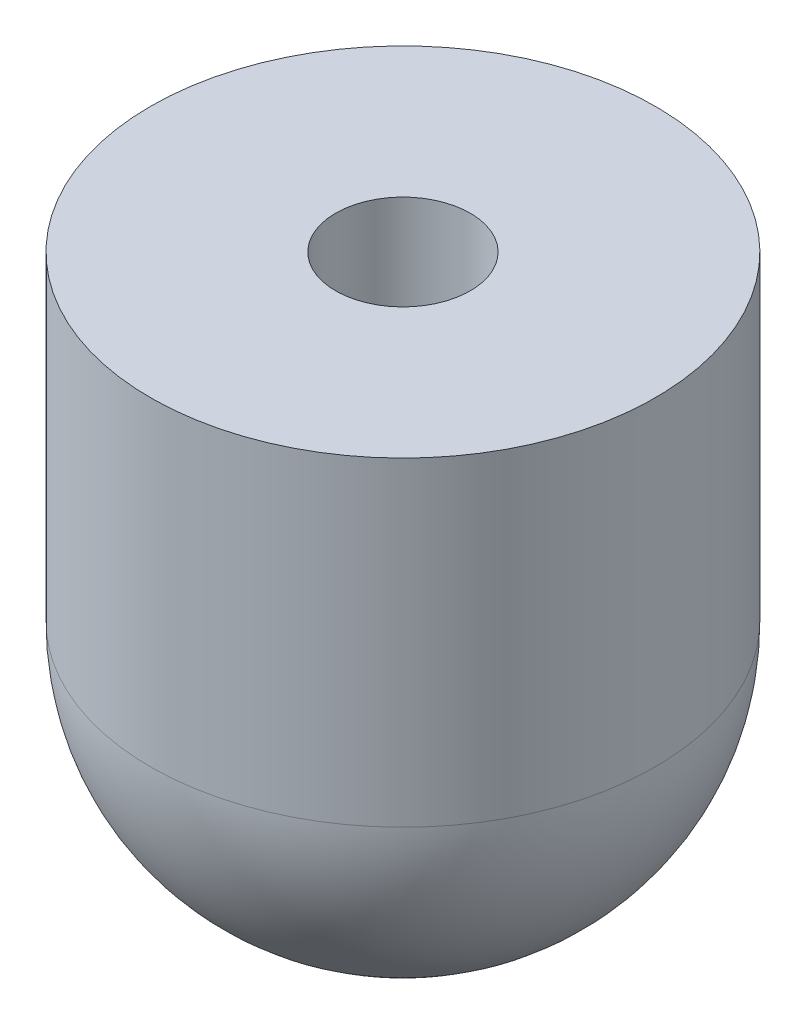
ISO-10303-21;
HEADER;
FILE_DESCRIPTION(('STEP AP214'),'2;1');
FILE_NAME('part.step','',(''),(''),'','','');
FILE_SCHEMA(('AUTOMOTIVE_DESIGN { 1 0 10303 214 1 1 1 1 }'));
ENDSEC;
DATA;
#1=APPLICATION_CONTEXT('core data for automotive mechanical design processes');
#2=APPLICATION_PROTOCOL_DEFINITION('international standard','automotive_design',2000,#1);
#3=PRODUCT_CONTEXT('',#1,'mechanical');
#4=PRODUCT('Part','Part','',(#3));
#5=PRODUCT_RELATED_PRODUCT_CATEGORY('part','',(#4));
#6=PRODUCT_DEFINITION_FORMATION('','',#4);
#7=PRODUCT_DEFINITION_CONTEXT('part definition',#1,'design');
#8=PRODUCT_DEFINITION('design','',#6,#7);
#9=PRODUCT_DEFINITION_SHAPE('','',#8);
#10=(LENGTH_UNIT() NAMED_UNIT(*) SI_UNIT(.MILLI.,.METRE.));
#11=(NAMED_UNIT(*) PLANE_ANGLE_UNIT() SI_UNIT($,.RADIAN.));
#12=(NAMED_UNIT(*) SI_UNIT($,.STERADIAN.) SOLID_ANGLE_UNIT());
#13=UNCERTAINTY_MEASURE_WITH_UNIT(LENGTH_MEASURE(1.E-05),#10,'distance_accuracy_value','');
#14=(GEOMETRIC_REPRESENTATION_CONTEXT(3) GLOBAL_UNCERTAINTY_ASSIGNED_CONTEXT((#13)) GLOBAL_UNIT_ASSIGNED_CONTEXT((#10,
#11,#12)) REPRESENTATION_CONTEXT('',''));
#15=CARTESIAN_POINT('',(0.,0.,0.));
#16=DIRECTION('',(0.,0.,1.));
#17=DIRECTION('',(1.,0.,0.));
#18=AXIS2_PLACEMENT_3D('',#15,#16,#17);
#19=CARTESIAN_POINT('',(0.,0.,0.));
#20=DIRECTION('',(0.,1.,0.));
#21=DIRECTION('',(-1.,0.,0.));
#22=AXIS2_PLACEMENT_3D('',#19,#20,#21);
#23=PLANE('',#22);
#24=CARTESIAN_POINT('',(0.,0.,0.));
#25=DIRECTION('',(0.,1.,0.));
#26=DIRECTION('',(-1.,0.,0.));
#27=AXIS2_PLACEMENT_3D('',#24,#25,#26);
#28=CIRCLE('',#27,2.);
#29=CARTESIAN_POINT('',(-2.,0.,0.));
#30=VERTEX_POINT('',#29);
#31=EDGE_CURVE('E196',#30,#30,#28,.T.);
#32=ORIENTED_EDGE('',*,*,#31,.F.);
#33=EDGE_LOOP('',(#32));
#34=FACE_BOUND('',#33,.T.);
#35=CARTESIAN_POINT('',(0.,0.,0.));
#36=DIRECTION('',(0.,1.,0.));
#37=DIRECTION('',(-1.,0.,0.));
#38=AXIS2_PLACEMENT_3D('',#35,#36,#37);
#39=CIRCLE('',#38,7.5);
#40=CARTESIAN_POINT('',(-7.5,0.,0.));
#41=VERTEX_POINT('',#40);
#42=EDGE_CURVE('E11',#41,#41,#39,.T.);
#43=ORIENTED_EDGE('',*,*,#42,.T.);
#44=EDGE_LOOP('',(#43));
#45=FACE_BOUND('',#44,.T.);
#46=ADVANCED_FACE('F45',(#34,#45),#23,.T.);
#47=CARTESIAN_POINT('',(0.,0.,0.));
#48=DIRECTION('',(0.,1.,0.));
#49=DIRECTION('',(-1.,0.,0.));
#50=AXIS2_PLACEMENT_3D('',#47,#48,#49);
#51=CYLINDRICAL_SURFACE('',#50,7.5);
#52=CARTESIAN_POINT('',(0.,-9.5,0.));
#53=DIRECTION('',(0.,1.,0.));
#54=DIRECTION('',(-1.,0.,0.));
#55=AXIS2_PLACEMENT_3D('',#52,#53,#54);
#56=CIRCLE('',#55,7.5);
#57=CARTESIAN_POINT('',(-7.5,-9.5,0.));
#58=VERTEX_POINT('',#57);
#59=EDGE_CURVE('E54',#58,#58,#56,.T.);
#60=ORIENTED_EDGE('',*,*,#59,.T.);
#61=EDGE_LOOP('',(#60));
#62=FACE_BOUND('',#61,.T.);
#63=ORIENTED_EDGE('',*,*,#42,.F.);
#64=EDGE_LOOP('',(#63));
#65=FACE_BOUND('',#64,.T.);
#66=ADVANCED_FACE('F172',(#62,#65),#51,.T.);
#67=CARTESIAN_POINT('',(0.,-9.5,0.));
#68=DIRECTION('',(0.,1.,0.));
#69=DIRECTION('',(-1.,0.,0.));
#70=AXIS2_PLACEMENT_3D('',#67,#68,#69);
#71=SPHERICAL_SURFACE('',#70,7.5);
#72=ORIENTED_EDGE('',*,*,#59,.F.);
#73=EDGE_LOOP('',(#72));
#74=FACE_BOUND('',#73,.T.);
#75=ADVANCED_FACE('F175',(#74),#71,.T.);
#76=CARTESIAN_POINT('',(0.,-17.001,0.));
#77=DIRECTION('',(0.,1.,0.));
#78=DIRECTION('',(-1.,0.,0.));
#79=AXIS2_PLACEMENT_3D('',#76,#77,#78);
#80=CYLINDRICAL_SURFACE('',#79,2.);
#81=ORIENTED_EDGE('',*,*,#31,.T.);
#82=EDGE_LOOP('',(#81));
#83=FACE_BOUND('',#82,.T.);
#84=CARTESIAN_POINT('',(0.,-3.,0.));
#85=DIRECTION('',(0.,1.,0.));
#86=DIRECTION('',(-1.,0.,0.));
#87=AXIS2_PLACEMENT_3D('',#84,#85,#86);
#88=CIRCLE('',#87,2.);
#89=CARTESIAN_POINT('',(-2.,-3.,0.));
#90=VERTEX_POINT('',#89);
#91=EDGE_CURVE('E141',#90,#90,#88,.F.);
#92=ORIENTED_EDGE('',*,*,#91,.T.);
#93=EDGE_LOOP('',(#92));
#94=FACE_BOUND('',#93,.T.);
#95=ADVANCED_FACE('F177',(#83,#94),#80,.F.);
#96=CARTESIAN_POINT('',(0.,-6.5,4.15692193816531));
#97=DIRECTION('',(0.5,0.,0.866025403784439));
#98=DIRECTION('',(0.866025403784439,0.,-0.5));
#99=AXIS2_PLACEMENT_3D('',#96,#97,#98);
#100=PLANE('',#99);
#101=DIRECTION('',(0.866025403784439,0.,-0.5));
#102=VECTOR('',#101,1.);
#103=CARTESIAN_POINT('',(0.,-3.,4.15692193816531));
#104=LINE('',#103,#102);
#105=CARTESIAN_POINT('',(0.,-3.,4.15692193816531));
#106=VERTEX_POINT('',#105);
#107=CARTESIAN_POINT('',(3.6,-3.,2.07846096908265));
#108=VERTEX_POINT('',#107);
#109=EDGE_CURVE('E137',#106,#108,#104,.T.);
#110=ORIENTED_EDGE('',*,*,#109,.T.);
#111=DIRECTION('',(0.,1.,0.));
#112=VECTOR('',#111,1.);
#113=CARTESIAN_POINT('',(3.6,-6.5,2.07846096908265));
#114=LINE('',#113,#112);
#115=CARTESIAN_POINT('',(3.6,-6.5,2.07846096908265));
#116=VERTEX_POINT('',#115);
#117=EDGE_CURVE('E91',#116,#108,#114,.T.);
#118=ORIENTED_EDGE('',*,*,#117,.F.);
#119=DIRECTION('',(0.866025403784439,0.,-0.5));
#120=VECTOR('',#119,1.);
#121=CARTESIAN_POINT('',(0.,-6.5,4.15692193816531));
#122=LINE('',#121,#120);
#123=CARTESIAN_POINT('',(0.,-6.5,4.15692193816531));
#124=VERTEX_POINT('',#123);
#125=EDGE_CURVE('E157',#124,#116,#122,.T.);
#126=ORIENTED_EDGE('',*,*,#125,.F.);
#127=DIRECTION('',(0.,1.,0.));
#128=VECTOR('',#127,1.);
#129=CARTESIAN_POINT('',(0.,-6.5,4.15692193816531));
#130=LINE('',#129,#128);
#131=EDGE_CURVE('E62',#124,#106,#130,.T.);
#132=ORIENTED_EDGE('',*,*,#131,.T.);
#133=EDGE_LOOP('',(#110,#118,#126,#132));
#134=FACE_BOUND('',#133,.T.);
#135=ADVANCED_FACE('F184',(#134),#100,.F.);
#136=CARTESIAN_POINT('',(-3.6,-6.5,2.07846096908265));
#137=DIRECTION('',(-0.5,0.,0.866025403784438));
#138=DIRECTION('',(0.866025403784439,0.,0.5));
#139=AXIS2_PLACEMENT_3D('',#136,#137,#138);
#140=PLANE('',#139);
#141=DIRECTION('',(0.866025403784438,0.,0.5));
#142=VECTOR('',#141,1.);
#143=CARTESIAN_POINT('',(-3.6,-3.,2.07846096908265));
#144=LINE('',#143,#142);
#145=CARTESIAN_POINT('',(-3.6,-3.,2.07846096908265));
#146=VERTEX_POINT('',#145);
#147=EDGE_CURVE('E154',#146,#106,#144,.T.);
#148=ORIENTED_EDGE('',*,*,#147,.T.);
#149=ORIENTED_EDGE('',*,*,#131,.F.);
#150=DIRECTION('',(0.866025403784438,0.,0.5));
#151=VECTOR('',#150,1.);
#152=CARTESIAN_POINT('',(-3.6,-6.5,2.07846096908265));
#153=LINE('',#152,#151);
#154=CARTESIAN_POINT('',(-3.6,-6.5,2.07846096908265));
#155=VERTEX_POINT('',#154);
#156=EDGE_CURVE('E121',#155,#124,#153,.T.);
#157=ORIENTED_EDGE('',*,*,#156,.F.);
#158=DIRECTION('',(0.,1.,0.));
#159=VECTOR('',#158,1.);
#160=CARTESIAN_POINT('',(-3.6,-6.5,2.07846096908265));
#161=LINE('',#160,#159);
#162=EDGE_CURVE('E82',#155,#146,#161,.T.);
#163=ORIENTED_EDGE('',*,*,#162,.T.);
#164=EDGE_LOOP('',(#148,#149,#157,#163));
#165=FACE_BOUND('',#164,.T.);
#166=ADVANCED_FACE('F215',(#165),#140,.F.);
#167=CARTESIAN_POINT('',(-3.6,-6.5,-2.07846096908265));
#168=DIRECTION('',(-1.,0.,0.));
#169=DIRECTION('',(0.,0.,1.));
#170=AXIS2_PLACEMENT_3D('',#167,#168,#169);
#171=PLANE('',#170);
#172=DIRECTION('',(0.,0.,1.));
#173=VECTOR('',#172,1.);
#174=CARTESIAN_POINT('',(-3.6,-3.,-2.07846096908265));
#175=LINE('',#174,#173);
#176=CARTESIAN_POINT('',(-3.6,-3.,-2.07846096908265));
#177=VERTEX_POINT('',#176);
#178=EDGE_CURVE('E151',#177,#146,#175,.T.);
#179=ORIENTED_EDGE('',*,*,#178,.T.);
#180=ORIENTED_EDGE('',*,*,#162,.F.);
#181=DIRECTION('',(0.,0.,1.));
#182=VECTOR('',#181,1.);
#183=CARTESIAN_POINT('',(-3.6,-6.5,-2.07846096908265));
#184=LINE('',#183,#182);
#185=CARTESIAN_POINT('',(-3.6,-6.5,-2.07846096908265));
#186=VERTEX_POINT('',#185);
#187=EDGE_CURVE('E116',#186,#155,#184,.T.);
#188=ORIENTED_EDGE('',*,*,#187,.F.);
#189=DIRECTION('',(0.,1.,0.));
#190=VECTOR('',#189,1.);
#191=CARTESIAN_POINT('',(-3.6,-6.5,-2.07846096908265));
#192=LINE('',#191,#190);
#193=EDGE_CURVE('E102',#186,#177,#192,.T.);
#194=ORIENTED_EDGE('',*,*,#193,.T.);
#195=EDGE_LOOP('',(#179,#180,#188,#194));
#196=FACE_BOUND('',#195,.T.);
#197=ADVANCED_FACE('F117',(#196),#171,.F.);
#198=CARTESIAN_POINT('',(0.,-6.5,-4.15692193816531));
#199=DIRECTION('',(-0.5,0.,-0.866025403784439));
#200=DIRECTION('',(-0.866025403784439,0.,0.5));
#201=AXIS2_PLACEMENT_3D('',#198,#199,#200);
#202=PLANE('',#201);
#203=DIRECTION('',(-0.866025403784439,0.,0.5));
#204=VECTOR('',#203,1.);
#205=CARTESIAN_POINT('',(0.,-3.,-4.15692193816531));
#206=LINE('',#205,#204);
#207=CARTESIAN_POINT('',(0.,-3.,-4.15692193816531));
#208=VERTEX_POINT('',#207);
#209=EDGE_CURVE('E109',#208,#177,#206,.T.);
#210=ORIENTED_EDGE('',*,*,#209,.T.);
#211=ORIENTED_EDGE('',*,*,#193,.F.);
#212=DIRECTION('',(-0.866025403784439,0.,0.5));
#213=VECTOR('',#212,1.);
#214=CARTESIAN_POINT('',(0.,-6.5,-4.15692193816531));
#215=LINE('',#214,#213);
#216=CARTESIAN_POINT('',(0.,-6.5,-4.15692193816531));
#217=VERTEX_POINT('',#216);
#218=EDGE_CURVE('E106',#217,#186,#215,.T.);
#219=ORIENTED_EDGE('',*,*,#218,.F.);
#220=DIRECTION('',(0.,1.,0.));
#221=VECTOR('',#220,1.);
#222=CARTESIAN_POINT('',(0.,-6.5,-4.15692193816531));
#223=LINE('',#222,#221);
#224=EDGE_CURVE('E113',#217,#208,#223,.T.);
#225=ORIENTED_EDGE('',*,*,#224,.T.);
#226=EDGE_LOOP('',(#210,#211,#219,#225));
#227=FACE_BOUND('',#226,.T.);
#228=ADVANCED_FACE('F104',(#227),#202,.F.);
#229=CARTESIAN_POINT('',(3.6,-6.5,-2.07846096908265));
#230=DIRECTION('',(0.5,0.,-0.866025403784439));
#231=DIRECTION('',(-0.866025403784439,0.,-0.5));
#232=AXIS2_PLACEMENT_3D('',#229,#230,#231);
#233=PLANE('',#232);
#234=DIRECTION('',(-0.866025403784439,0.,-0.5));
#235=VECTOR('',#234,1.);
#236=CARTESIAN_POINT('',(3.6,-3.,-2.07846096908265));
#237=LINE('',#236,#235);
#238=CARTESIAN_POINT('',(3.6,-3.,-2.07846096908265));
#239=VERTEX_POINT('',#238);
#240=EDGE_CURVE('E145',#239,#208,#237,.T.);
#241=ORIENTED_EDGE('',*,*,#240,.T.);
#242=ORIENTED_EDGE('',*,*,#224,.F.);
#243=DIRECTION('',(-0.866025403784439,0.,-0.5));
#244=VECTOR('',#243,1.);
#245=CARTESIAN_POINT('',(3.6,-6.5,-2.07846096908265));
#246=LINE('',#245,#244);
#247=CARTESIAN_POINT('',(3.6,-6.5,-2.07846096908265));
#248=VERTEX_POINT('',#247);
#249=EDGE_CURVE('E127',#248,#217,#246,.T.);
#250=ORIENTED_EDGE('',*,*,#249,.F.);
#251=DIRECTION('',(0.,1.,0.));
#252=VECTOR('',#251,1.);
#253=CARTESIAN_POINT('',(3.6,-6.5,-2.07846096908265));
#254=LINE('',#253,#252);
#255=EDGE_CURVE('E164',#248,#239,#254,.T.);
#256=ORIENTED_EDGE('',*,*,#255,.T.);
#257=EDGE_LOOP('',(#241,#242,#250,#256));
#258=FACE_BOUND('',#257,.T.);
#259=ADVANCED_FACE('F211',(#258),#233,.F.);
#260=CARTESIAN_POINT('',(3.6,-6.5,2.07846096908265));
#261=DIRECTION('',(1.,0.,0.));
#262=DIRECTION('',(0.,0.,-1.));
#263=AXIS2_PLACEMENT_3D('',#260,#261,#262);
#264=PLANE('',#263);
#265=DIRECTION('',(0.,0.,-1.));
#266=VECTOR('',#265,1.);
#267=CARTESIAN_POINT('',(3.6,-3.,2.07846096908265));
#268=LINE('',#267,#266);
#269=EDGE_CURVE('E140',#108,#239,#268,.T.);
#270=ORIENTED_EDGE('',*,*,#269,.T.);
#271=ORIENTED_EDGE('',*,*,#255,.F.);
#272=DIRECTION('',(0.,0.,-1.));
#273=VECTOR('',#272,1.);
#274=CARTESIAN_POINT('',(3.6,-6.5,2.07846096908265));
#275=LINE('',#274,#273);
#276=EDGE_CURVE('E131',#116,#248,#275,.T.);
#277=ORIENTED_EDGE('',*,*,#276,.F.);
#278=ORIENTED_EDGE('',*,*,#117,.T.);
#279=EDGE_LOOP('',(#270,#271,#277,#278));
#280=FACE_BOUND('',#279,.T.);
#281=ADVANCED_FACE('F207',(#280),#264,.F.);
#282=CARTESIAN_POINT('',(0.,-6.5,0.));
#283=DIRECTION('',(0.,1.,0.));
#284=DIRECTION('',(-1.,0.,0.));
#285=AXIS2_PLACEMENT_3D('',#282,#283,#284);
#286=PLANE('',#285);
#287=ORIENTED_EDGE('',*,*,#125,.T.);
#288=ORIENTED_EDGE('',*,*,#276,.T.);
#289=ORIENTED_EDGE('',*,*,#249,.T.);
#290=ORIENTED_EDGE('',*,*,#218,.T.);
#291=ORIENTED_EDGE('',*,*,#187,.T.);
#292=ORIENTED_EDGE('',*,*,#156,.T.);
#293=EDGE_LOOP('',(#287,#288,#289,#290,#291,#292));
#294=FACE_BOUND('',#293,.T.);
#295=ADVANCED_FACE('F124',(#294),#286,.T.);
#296=CARTESIAN_POINT('',(0.,-3.,0.));
#297=DIRECTION('',(0.,1.,0.));
#298=DIRECTION('',(-1.,0.,0.));
#299=AXIS2_PLACEMENT_3D('',#296,#297,#298);
#300=PLANE('',#299);
#301=ORIENTED_EDGE('',*,*,#91,.F.);
#302=EDGE_LOOP('',(#301));
#303=FACE_BOUND('',#302,.T.);
#304=ORIENTED_EDGE('',*,*,#109,.F.);
#305=ORIENTED_EDGE('',*,*,#147,.F.);
#306=ORIENTED_EDGE('',*,*,#178,.F.);
#307=ORIENTED_EDGE('',*,*,#209,.F.);
#308=ORIENTED_EDGE('',*,*,#240,.F.);
#309=ORIENTED_EDGE('',*,*,#269,.F.);
#310=EDGE_LOOP('',(#304,#305,#306,#307,#308,#309));
#311=FACE_BOUND('',#310,.T.);
#312=ADVANCED_FACE('F213',(#303,#311),#300,.F.);
#313=CLOSED_SHELL('',(#46,#66,#75,#95,#135,#166,#197,#228,#259,#281,#295,#312));
#314=MANIFOLD_SOLID_BREP('B2',#313);
#315=ADVANCED_BREP_SHAPE_REPRESENTATION('',(#18,#314),#14);
#316=SHAPE_DEFINITION_REPRESENTATION(#9,#315);
ENDSEC;
END-ISO-10303-21;
